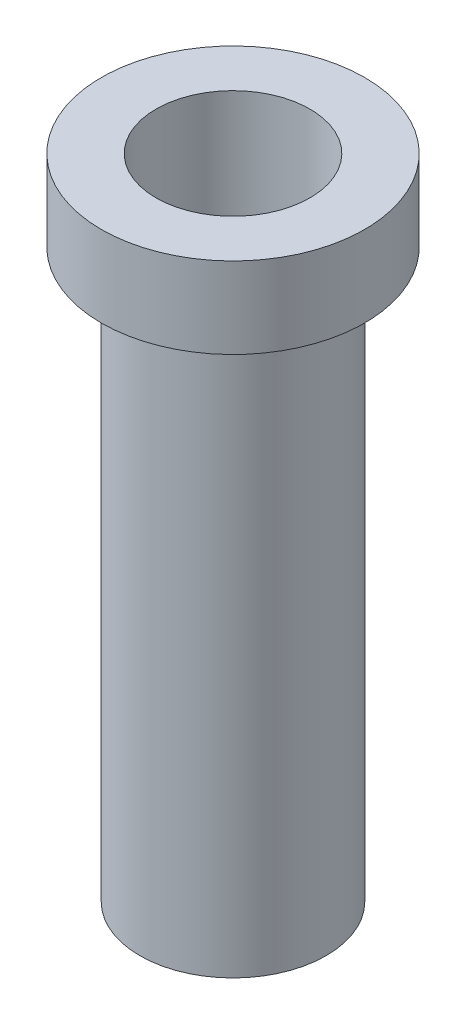
ISO-10303-21;
HEADER;
FILE_DESCRIPTION(('STEP AP214'),'2;1');
FILE_NAME('part.step','',(''),(''),'','','');
FILE_SCHEMA(('AUTOMOTIVE_DESIGN { 1 0 10303 214 1 1 1 1 }'));
ENDSEC;
DATA;
#1=APPLICATION_CONTEXT('core data for automotive mechanical design processes');
#2=APPLICATION_PROTOCOL_DEFINITION('international standard','automotive_design',2000,#1);
#3=PRODUCT_CONTEXT('',#1,'mechanical');
#4=PRODUCT('Part','Part','',(#3));
#5=PRODUCT_RELATED_PRODUCT_CATEGORY('part','',(#4));
#6=PRODUCT_DEFINITION_FORMATION('','',#4);
#7=PRODUCT_DEFINITION_CONTEXT('part definition',#1,'design');
#8=PRODUCT_DEFINITION('design','',#6,#7);
#9=PRODUCT_DEFINITION_SHAPE('','',#8);
#10=(LENGTH_UNIT() NAMED_UNIT(*) SI_UNIT(.MILLI.,.METRE.));
#11=(NAMED_UNIT(*) PLANE_ANGLE_UNIT() SI_UNIT($,.RADIAN.));
#12=(NAMED_UNIT(*) SI_UNIT($,.STERADIAN.) SOLID_ANGLE_UNIT());
#13=UNCERTAINTY_MEASURE_WITH_UNIT(LENGTH_MEASURE(1.E-05),#10,'distance_accuracy_value','');
#14=(GEOMETRIC_REPRESENTATION_CONTEXT(3) GLOBAL_UNCERTAINTY_ASSIGNED_CONTEXT((#13)) GLOBAL_UNIT_ASSIGNED_CONTEXT((#10,
#11,#12)) REPRESENTATION_CONTEXT('',''));
#15=CARTESIAN_POINT('',(0.,0.,0.));
#16=DIRECTION('',(0.,0.,1.));
#17=DIRECTION('',(1.,0.,0.));
#18=AXIS2_PLACEMENT_3D('',#15,#16,#17);
#19=CARTESIAN_POINT('',(0.,2.,0.));
#20=DIRECTION('',(0.,-1.,0.));
#21=DIRECTION('',(0.,0.,-1.));
#22=AXIS2_PLACEMENT_3D('',#19,#20,#21);
#23=CYLINDRICAL_SURFACE('',#22,3.25);
#24=CARTESIAN_POINT('',(0.,2.,0.));
#25=DIRECTION('',(0.,1.,0.));
#26=DIRECTION('',(0.,0.,1.));
#27=AXIS2_PLACEMENT_3D('',#24,#25,#26);
#28=CIRCLE('',#27,3.25);
#29=CARTESIAN_POINT('',(0.,2.,3.25));
#30=VERTEX_POINT('',#29);
#31=EDGE_CURVE('E38',#30,#30,#28,.T.);
#32=ORIENTED_EDGE('',*,*,#31,.F.);
#33=EDGE_LOOP('',(#32));
#34=FACE_BOUND('',#33,.T.);
#35=CARTESIAN_POINT('',(0.,0.,0.));
#36=DIRECTION('',(0.,1.,0.));
#37=DIRECTION('',(0.,0.,1.));
#38=AXIS2_PLACEMENT_3D('',#35,#36,#37);
#39=CIRCLE('',#38,3.25);
#40=CARTESIAN_POINT('',(0.,0.,3.25));
#41=VERTEX_POINT('',#40);
#42=EDGE_CURVE('E34',#41,#41,#39,.T.);
#43=ORIENTED_EDGE('',*,*,#42,.T.);
#44=EDGE_LOOP('',(#43));
#45=FACE_BOUND('',#44,.T.);
#46=ADVANCED_FACE('F31',(#34,#45),#23,.T.);
#47=CARTESIAN_POINT('',(0.,2.,0.));
#48=DIRECTION('',(0.,1.,0.));
#49=DIRECTION('',(0.,0.,1.));
#50=AXIS2_PLACEMENT_3D('',#47,#48,#49);
#51=PLANE('',#50);
#52=CARTESIAN_POINT('',(0.,2.,0.));
#53=DIRECTION('',(0.,1.,0.));
#54=DIRECTION('',(0.,0.,1.));
#55=AXIS2_PLACEMENT_3D('',#52,#53,#54);
#56=CIRCLE('',#55,1.9);
#57=CARTESIAN_POINT('',(0.,2.,1.9));
#58=VERTEX_POINT('',#57);
#59=EDGE_CURVE('E48',#58,#58,#56,.T.);
#60=ORIENTED_EDGE('',*,*,#59,.F.);
#61=EDGE_LOOP('',(#60));
#62=FACE_BOUND('',#61,.T.);
#63=ORIENTED_EDGE('',*,*,#31,.T.);
#64=EDGE_LOOP('',(#63));
#65=FACE_BOUND('',#64,.T.);
#66=ADVANCED_FACE('F63',(#62,#65),#51,.T.);
#67=CARTESIAN_POINT('',(0.,0.,0.));
#68=DIRECTION('',(0.,1.,0.));
#69=DIRECTION('',(0.,0.,1.));
#70=AXIS2_PLACEMENT_3D('',#67,#68,#69);
#71=PLANE('',#70);
#72=CARTESIAN_POINT('',(0.,0.,0.));
#73=DIRECTION('',(0.,-1.,0.));
#74=DIRECTION('',(0.,0.,-1.));
#75=AXIS2_PLACEMENT_3D('',#72,#73,#74);
#76=CIRCLE('',#75,2.3);
#77=CARTESIAN_POINT('',(0.,0.,-2.3));
#78=VERTEX_POINT('',#77);
#79=EDGE_CURVE('E10',#78,#78,#76,.T.);
#80=ORIENTED_EDGE('',*,*,#79,.F.);
#81=EDGE_LOOP('',(#80));
#82=FACE_BOUND('',#81,.T.);
#83=ORIENTED_EDGE('',*,*,#42,.F.);
#84=EDGE_LOOP('',(#83));
#85=FACE_BOUND('',#84,.T.);
#86=ADVANCED_FACE('F66',(#82,#85),#71,.F.);
#87=CARTESIAN_POINT('',(0.,-14.,0.));
#88=DIRECTION('',(0.,1.,0.));
#89=DIRECTION('',(0.,0.,1.));
#90=AXIS2_PLACEMENT_3D('',#87,#88,#89);
#91=CYLINDRICAL_SURFACE('',#90,2.3);
#92=CARTESIAN_POINT('',(0.,-14.,0.));
#93=DIRECTION('',(0.,-1.,0.));
#94=DIRECTION('',(0.,0.,-1.));
#95=AXIS2_PLACEMENT_3D('',#92,#93,#94);
#96=CIRCLE('',#95,2.3);
#97=CARTESIAN_POINT('',(0.,-14.,-2.3));
#98=VERTEX_POINT('',#97);
#99=EDGE_CURVE('E44',#98,#98,#96,.T.);
#100=ORIENTED_EDGE('',*,*,#99,.F.);
#101=EDGE_LOOP('',(#100));
#102=FACE_BOUND('',#101,.T.);
#103=ORIENTED_EDGE('',*,*,#79,.T.);
#104=EDGE_LOOP('',(#103));
#105=FACE_BOUND('',#104,.T.);
#106=ADVANCED_FACE('F76',(#102,#105),#91,.T.);
#107=CARTESIAN_POINT('',(0.,-14.,0.));
#108=DIRECTION('',(0.,-1.,0.));
#109=DIRECTION('',(0.,0.,-1.));
#110=AXIS2_PLACEMENT_3D('',#107,#108,#109);
#111=PLANE('',#110);
#112=CARTESIAN_POINT('',(0.,-14.,0.));
#113=DIRECTION('',(0.,1.,0.));
#114=DIRECTION('',(0.,0.,1.));
#115=AXIS2_PLACEMENT_3D('',#112,#113,#114);
#116=CIRCLE('',#115,1.9);
#117=CARTESIAN_POINT('',(0.,-14.,1.9));
#118=VERTEX_POINT('',#117);
#119=EDGE_CURVE('E47',#118,#118,#116,.T.);
#120=ORIENTED_EDGE('',*,*,#119,.T.);
#121=EDGE_LOOP('',(#120));
#122=FACE_BOUND('',#121,.T.);
#123=ORIENTED_EDGE('',*,*,#99,.T.);
#124=EDGE_LOOP('',(#123));
#125=FACE_BOUND('',#124,.T.);
#126=ADVANCED_FACE('F54',(#122,#125),#111,.T.);
#127=CARTESIAN_POINT('',(0.,-14.,0.));
#128=DIRECTION('',(0.,1.,0.));
#129=DIRECTION('',(0.,0.,1.));
#130=AXIS2_PLACEMENT_3D('',#127,#128,#129);
#131=CYLINDRICAL_SURFACE('',#130,1.9);
#132=ORIENTED_EDGE('',*,*,#119,.F.);
#133=EDGE_LOOP('',(#132));
#134=FACE_BOUND('',#133,.T.);
#135=ORIENTED_EDGE('',*,*,#59,.T.);
#136=EDGE_LOOP('',(#135));
#137=FACE_BOUND('',#136,.T.);
#138=ADVANCED_FACE('F57',(#134,#137),#131,.F.);
#139=CLOSED_SHELL('',(#46,#66,#86,#106,#126,#138));
#140=MANIFOLD_SOLID_BREP('B2',#139);
#141=ADVANCED_BREP_SHAPE_REPRESENTATION('',(#18,#140),#14);
#142=SHAPE_DEFINITION_REPRESENTATION(#9,#141);
ENDSEC;
END-ISO-10303-21;
